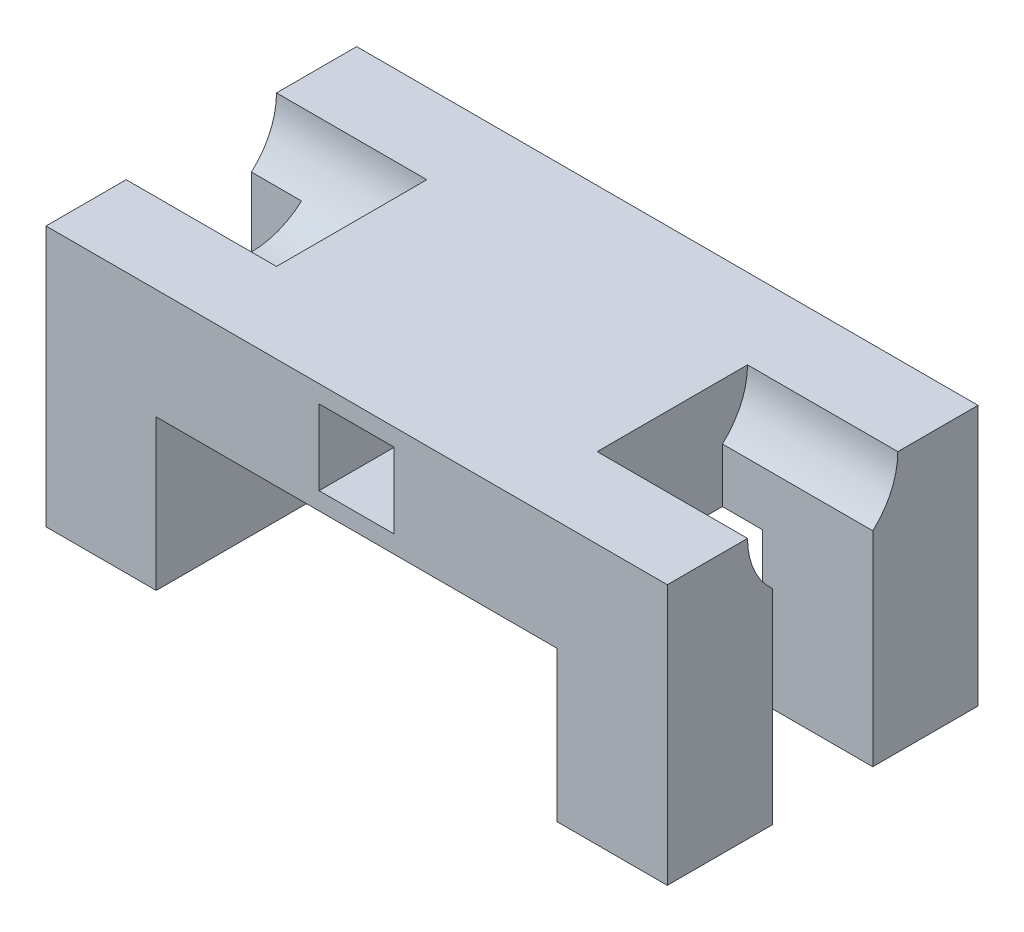
ISO-10303-21;
HEADER;
FILE_DESCRIPTION(('STEP AP214'),'2;1');
FILE_NAME('part.step','',(''),(''),'','','');
FILE_SCHEMA(('AUTOMOTIVE_DESIGN { 1 0 10303 214 1 1 1 1 }'));
ENDSEC;
DATA;
#1=APPLICATION_CONTEXT('core data for automotive mechanical design processes');
#2=APPLICATION_PROTOCOL_DEFINITION('international standard','automotive_design',2000,#1);
#3=PRODUCT_CONTEXT('',#1,'mechanical');
#4=PRODUCT('Part','Part','',(#3));
#5=PRODUCT_RELATED_PRODUCT_CATEGORY('part','',(#4));
#6=PRODUCT_DEFINITION_FORMATION('','',#4);
#7=PRODUCT_DEFINITION_CONTEXT('part definition',#1,'design');
#8=PRODUCT_DEFINITION('design','',#6,#7);
#9=PRODUCT_DEFINITION_SHAPE('','',#8);
#10=(LENGTH_UNIT() NAMED_UNIT(*) SI_UNIT(.MILLI.,.METRE.));
#11=(NAMED_UNIT(*) PLANE_ANGLE_UNIT() SI_UNIT($,.RADIAN.));
#12=(NAMED_UNIT(*) SI_UNIT($,.STERADIAN.) SOLID_ANGLE_UNIT());
#13=UNCERTAINTY_MEASURE_WITH_UNIT(LENGTH_MEASURE(1.E-05),#10,'distance_accuracy_value','');
#14=(GEOMETRIC_REPRESENTATION_CONTEXT(3) GLOBAL_UNCERTAINTY_ASSIGNED_CONTEXT((#13)) GLOBAL_UNIT_ASSIGNED_CONTEXT((#10,
#11,#12)) REPRESENTATION_CONTEXT('',''));
#15=CARTESIAN_POINT('',(0.,0.,0.));
#16=DIRECTION('',(0.,0.,1.));
#17=DIRECTION('',(1.,0.,0.));
#18=AXIS2_PLACEMENT_3D('',#15,#16,#17);
#19=CARTESIAN_POINT('',(102.,0.0297956274635156,62.));
#20=DIRECTION('',(1.,0.,0.));
#21=DIRECTION('',(0.,0.,-1.));
#22=AXIS2_PLACEMENT_3D('',#19,#20,#21);
#23=PLANE('',#22);
#24=DIRECTION('',(0.,0.,-1.));
#25=VECTOR('',#24,1.);
#26=CARTESIAN_POINT('',(102.,0.0297956274635156,62.));
#27=LINE('',#26,#25);
#28=CARTESIAN_POINT('',(102.,0.0297956274635156,21.));
#29=VERTEX_POINT('',#28);
#30=CARTESIAN_POINT('',(102.,0.0297956274635156,0.));
#31=VERTEX_POINT('',#30);
#32=EDGE_CURVE('E457',#29,#31,#27,.T.);
#33=ORIENTED_EDGE('',*,*,#32,.F.);
#34=DIRECTION('',(0.,1.,0.));
#35=VECTOR('',#34,1.);
#36=CARTESIAN_POINT('',(102.,0.0297956274635156,21.));
#37=LINE('',#36,#35);
#38=CARTESIAN_POINT('',(102.,30.,21.));
#39=VERTEX_POINT('',#38);
#40=EDGE_CURVE('E281',#29,#39,#37,.T.);
#41=ORIENTED_EDGE('',*,*,#40,.T.);
#42=DIRECTION('',(0.,0.,-1.));
#43=VECTOR('',#42,1.);
#44=CARTESIAN_POINT('',(102.,30.,62.));
#45=LINE('',#44,#43);
#46=CARTESIAN_POINT('',(102.,30.,0.));
#47=VERTEX_POINT('',#46);
#48=EDGE_CURVE('E462',#39,#47,#45,.T.);
#49=ORIENTED_EDGE('',*,*,#48,.T.);
#50=DIRECTION('',(0.,-1.,0.));
#51=VECTOR('',#50,1.);
#52=CARTESIAN_POINT('',(102.,0.0297956274635156,0.));
#53=LINE('',#52,#51);
#54=EDGE_CURVE('E420',#47,#31,#53,.T.);
#55=ORIENTED_EDGE('',*,*,#54,.T.);
#56=EDGE_LOOP('',(#33,#41,#49,#55));
#57=FACE_BOUND('',#56,.T.);
#58=ADVANCED_FACE('F39',(#57),#23,.F.);
#59=CARTESIAN_POINT('',(124.,0.0297956274635164,62.));
#60=DIRECTION('',(0.,1.,0.));
#61=DIRECTION('',(-1.,0.,0.));
#62=AXIS2_PLACEMENT_3D('',#59,#60,#61);
#63=PLANE('',#62);
#64=DIRECTION('',(0.,0.,-1.));
#65=VECTOR('',#64,1.);
#66=CARTESIAN_POINT('',(124.,0.0297956274635164,62.));
#67=LINE('',#66,#65);
#68=CARTESIAN_POINT('',(124.,0.0297956274635316,21.));
#69=VERTEX_POINT('',#68);
#70=CARTESIAN_POINT('',(124.,0.0297956274635164,0.));
#71=VERTEX_POINT('',#70);
#72=EDGE_CURVE('E452',#69,#71,#67,.T.);
#73=ORIENTED_EDGE('',*,*,#72,.F.);
#74=DIRECTION('',(-1.,0.,0.));
#75=VECTOR('',#74,1.);
#76=CARTESIAN_POINT('',(124.,0.0297956274635164,21.));
#77=LINE('',#76,#75);
#78=EDGE_CURVE('E277',#69,#29,#77,.T.);
#79=ORIENTED_EDGE('',*,*,#78,.T.);
#80=ORIENTED_EDGE('',*,*,#32,.T.);
#81=DIRECTION('',(1.,0.,0.));
#82=VECTOR('',#81,1.);
#83=CARTESIAN_POINT('',(124.,0.0297956274635164,0.));
#84=LINE('',#83,#82);
#85=EDGE_CURVE('E424',#31,#71,#84,.T.);
#86=ORIENTED_EDGE('',*,*,#85,.T.);
#87=EDGE_LOOP('',(#73,#79,#80,#86));
#88=FACE_BOUND('',#87,.T.);
#89=ADVANCED_FACE('F539',(#88),#63,.F.);
#90=CARTESIAN_POINT('',(124.,52.,62.));
#91=DIRECTION('',(-1.,0.,0.));
#92=DIRECTION('',(0.,0.,1.));
#93=AXIS2_PLACEMENT_3D('',#90,#91,#92);
#94=PLANE('',#93);
#95=DIRECTION('',(0.,0.,-1.));
#96=VECTOR('',#95,1.);
#97=CARTESIAN_POINT('',(124.,52.,62.));
#98=LINE('',#97,#96);
#99=CARTESIAN_POINT('',(124.,52.,16.));
#100=VERTEX_POINT('',#99);
#101=CARTESIAN_POINT('',(124.,52.,0.));
#102=VERTEX_POINT('',#101);
#103=EDGE_CURVE('E448',#100,#102,#98,.T.);
#104=ORIENTED_EDGE('',*,*,#103,.F.);
#105=CARTESIAN_POINT('',(124.,52.,31.));
#106=DIRECTION('',(1.,0.,0.));
#107=DIRECTION('',(0.,0.,-1.));
#108=AXIS2_PLACEMENT_3D('',#105,#106,#107);
#109=CIRCLE('',#108,15.);
#110=CARTESIAN_POINT('',(124.,40.819660112501,21.));
#111=VERTEX_POINT('',#110);
#112=EDGE_CURVE('E235',#111,#100,#109,.T.);
#113=ORIENTED_EDGE('',*,*,#112,.F.);
#114=DIRECTION('',(0.,1.,0.));
#115=VECTOR('',#114,1.);
#116=CARTESIAN_POINT('',(124.,52.,21.));
#117=LINE('',#116,#115);
#118=EDGE_CURVE('E250',#69,#111,#117,.T.);
#119=ORIENTED_EDGE('',*,*,#118,.F.);
#120=ORIENTED_EDGE('',*,*,#72,.T.);
#121=DIRECTION('',(0.,1.,0.));
#122=VECTOR('',#121,1.);
#123=CARTESIAN_POINT('',(124.,52.,0.));
#124=LINE('',#123,#122);
#125=EDGE_CURVE('E428',#71,#102,#124,.T.);
#126=ORIENTED_EDGE('',*,*,#125,.T.);
#127=EDGE_LOOP('',(#104,#113,#119,#120,#126));
#128=FACE_BOUND('',#127,.T.);
#129=ADVANCED_FACE('F542',(#128),#94,.F.);
#130=CARTESIAN_POINT('',(0.,0.,62.));
#131=DIRECTION('',(1.,0.,0.));
#132=DIRECTION('',(0.,0.,-1.));
#133=AXIS2_PLACEMENT_3D('',#130,#131,#132);
#134=PLANE('',#133);
#135=DIRECTION('',(0.,-1.,0.));
#136=VECTOR('',#135,1.);
#137=CARTESIAN_POINT('',(0.,0.,21.));
#138=LINE('',#137,#136);
#139=CARTESIAN_POINT('',(0.,40.8196601125011,21.));
#140=VERTEX_POINT('',#139);
#141=CARTESIAN_POINT('',(0.,0.,21.));
#142=VERTEX_POINT('',#141);
#143=EDGE_CURVE('E314',#140,#142,#138,.T.);
#144=ORIENTED_EDGE('',*,*,#143,.F.);
#145=CARTESIAN_POINT('',(0.,52.,31.));
#146=DIRECTION('',(-1.,0.,0.));
#147=DIRECTION('',(0.,0.,1.));
#148=AXIS2_PLACEMENT_3D('',#145,#146,#147);
#149=CIRCLE('',#148,15.);
#150=CARTESIAN_POINT('',(0.,52.,16.));
#151=VERTEX_POINT('',#150);
#152=EDGE_CURVE('E295',#151,#140,#149,.T.);
#153=ORIENTED_EDGE('',*,*,#152,.F.);
#154=DIRECTION('',(0.,0.,-1.));
#155=VECTOR('',#154,1.);
#156=CARTESIAN_POINT('',(0.,52.,62.));
#157=LINE('',#156,#155);
#158=CARTESIAN_POINT('',(0.,52.,0.));
#159=VERTEX_POINT('',#158);
#160=EDGE_CURVE('E443',#151,#159,#157,.T.);
#161=ORIENTED_EDGE('',*,*,#160,.T.);
#162=DIRECTION('',(0.,-1.,0.));
#163=VECTOR('',#162,1.);
#164=CARTESIAN_POINT('',(0.,0.,0.));
#165=LINE('',#164,#163);
#166=CARTESIAN_POINT('',(0.,0.,0.));
#167=VERTEX_POINT('',#166);
#168=EDGE_CURVE('E388',#159,#167,#165,.T.);
#169=ORIENTED_EDGE('',*,*,#168,.T.);
#170=DIRECTION('',(0.,0.,-1.));
#171=VECTOR('',#170,1.);
#172=CARTESIAN_POINT('',(0.,0.,62.));
#173=LINE('',#172,#171);
#174=EDGE_CURVE('E409',#142,#167,#173,.T.);
#175=ORIENTED_EDGE('',*,*,#174,.F.);
#176=EDGE_LOOP('',(#144,#153,#161,#169,#175));
#177=FACE_BOUND('',#176,.T.);
#178=ADVANCED_FACE('F515',(#177),#134,.F.);
#179=CARTESIAN_POINT('',(0.,0.,62.));
#180=DIRECTION('',(0.,0.,-1.));
#181=DIRECTION('',(-1.,0.,0.));
#182=AXIS2_PLACEMENT_3D('',#179,#180,#181);
#183=PLANE('',#182);
#184=DIRECTION('',(1.,0.,0.));
#185=VECTOR('',#184,1.);
#186=CARTESIAN_POINT('',(22.,0.,62.));
#187=LINE('',#186,#185);
#188=CARTESIAN_POINT('',(0.,0.,62.));
#189=VERTEX_POINT('',#188);
#190=CARTESIAN_POINT('',(22.,0.,62.));
#191=VERTEX_POINT('',#190);
#192=EDGE_CURVE('E383',#189,#191,#187,.T.);
#193=ORIENTED_EDGE('',*,*,#192,.T.);
#194=DIRECTION('',(0.,1.,0.));
#195=VECTOR('',#194,1.);
#196=CARTESIAN_POINT('',(22.,30.,62.));
#197=LINE('',#196,#195);
#198=CARTESIAN_POINT('',(22.,30.,62.));
#199=VERTEX_POINT('',#198);
#200=EDGE_CURVE('E387',#191,#199,#197,.T.);
#201=ORIENTED_EDGE('',*,*,#200,.T.);
#202=DIRECTION('',(1.,0.,0.));
#203=VECTOR('',#202,1.);
#204=CARTESIAN_POINT('',(102.,30.,62.));
#205=LINE('',#204,#203);
#206=CARTESIAN_POINT('',(102.,30.,62.));
#207=VERTEX_POINT('',#206);
#208=EDGE_CURVE('E391',#199,#207,#205,.T.);
#209=ORIENTED_EDGE('',*,*,#208,.T.);
#210=DIRECTION('',(0.,-1.,0.));
#211=VECTOR('',#210,1.);
#212=CARTESIAN_POINT('',(102.,0.0297956274635156,62.));
#213=LINE('',#212,#211);
#214=CARTESIAN_POINT('',(102.,0.0297956274635156,62.));
#215=VERTEX_POINT('',#214);
#216=EDGE_CURVE('E394',#207,#215,#213,.T.);
#217=ORIENTED_EDGE('',*,*,#216,.T.);
#218=DIRECTION('',(1.,0.,0.));
#219=VECTOR('',#218,1.);
#220=CARTESIAN_POINT('',(124.,0.0297956274635164,62.));
#221=LINE('',#220,#219);
#222=CARTESIAN_POINT('',(124.,0.0297956274635164,62.));
#223=VERTEX_POINT('',#222);
#224=EDGE_CURVE('E397',#215,#223,#221,.T.);
#225=ORIENTED_EDGE('',*,*,#224,.T.);
#226=DIRECTION('',(0.,1.,0.));
#227=VECTOR('',#226,1.);
#228=CARTESIAN_POINT('',(124.,52.,62.));
#229=LINE('',#228,#227);
#230=CARTESIAN_POINT('',(124.,52.,62.));
#231=VERTEX_POINT('',#230);
#232=EDGE_CURVE('E400',#223,#231,#229,.T.);
#233=ORIENTED_EDGE('',*,*,#232,.T.);
#234=DIRECTION('',(-1.,0.,0.));
#235=VECTOR('',#234,1.);
#236=CARTESIAN_POINT('',(0.,52.,62.));
#237=LINE('',#236,#235);
#238=CARTESIAN_POINT('',(0.,52.,62.));
#239=VERTEX_POINT('',#238);
#240=EDGE_CURVE('E403',#231,#239,#237,.T.);
#241=ORIENTED_EDGE('',*,*,#240,.T.);
#242=DIRECTION('',(0.,-1.,0.));
#243=VECTOR('',#242,1.);
#244=CARTESIAN_POINT('',(0.,0.,62.));
#245=LINE('',#244,#243);
#246=EDGE_CURVE('E406',#239,#189,#245,.T.);
#247=ORIENTED_EDGE('',*,*,#246,.T.);
#248=EDGE_LOOP('',(#193,#201,#209,#217,#225,#233,#241,#247));
#249=FACE_BOUND('',#248,.T.);
#250=DIRECTION('',(0.,1.,0.));
#251=VECTOR('',#250,1.);
#252=CARTESIAN_POINT('',(69.5,48.5,62.));
#253=LINE('',#252,#251);
#254=CARTESIAN_POINT('',(69.5,33.5,62.));
#255=VERTEX_POINT('',#254);
#256=CARTESIAN_POINT('',(69.5,48.5,62.));
#257=VERTEX_POINT('',#256);
#258=EDGE_CURVE('E340',#255,#257,#253,.T.);
#259=ORIENTED_EDGE('',*,*,#258,.F.);
#260=DIRECTION('',(1.,0.,0.));
#261=VECTOR('',#260,1.);
#262=CARTESIAN_POINT('',(69.5,33.5,62.));
#263=LINE('',#262,#261);
#264=CARTESIAN_POINT('',(54.5,33.5,62.));
#265=VERTEX_POINT('',#264);
#266=EDGE_CURVE('E351',#265,#255,#263,.T.);
#267=ORIENTED_EDGE('',*,*,#266,.F.);
#268=DIRECTION('',(0.,-1.,0.));
#269=VECTOR('',#268,1.);
#270=CARTESIAN_POINT('',(54.5,48.5,62.));
#271=LINE('',#270,#269);
#272=CARTESIAN_POINT('',(54.5,48.5,62.));
#273=VERTEX_POINT('',#272);
#274=EDGE_CURVE('E347',#273,#265,#271,.T.);
#275=ORIENTED_EDGE('',*,*,#274,.F.);
#276=DIRECTION('',(-1.,0.,0.));
#277=VECTOR('',#276,1.);
#278=CARTESIAN_POINT('',(69.5,48.5,62.));
#279=LINE('',#278,#277);
#280=EDGE_CURVE('E343',#257,#273,#279,.T.);
#281=ORIENTED_EDGE('',*,*,#280,.F.);
#282=EDGE_LOOP('',(#259,#267,#275,#281));
#283=FACE_BOUND('',#282,.T.);
#284=ADVANCED_FACE('F496',(#249,#283),#183,.F.);
#285=CARTESIAN_POINT('',(0.,0.,0.));
#286=DIRECTION('',(0.,0.,-1.));
#287=DIRECTION('',(-1.,0.,0.));
#288=AXIS2_PLACEMENT_3D('',#285,#286,#287);
#289=PLANE('',#288);
#290=DIRECTION('',(1.,0.,0.));
#291=VECTOR('',#290,1.);
#292=CARTESIAN_POINT('',(22.,0.,0.));
#293=LINE('',#292,#291);
#294=CARTESIAN_POINT('',(22.,0.,0.));
#295=VERTEX_POINT('',#294);
#296=EDGE_CURVE('E382',#167,#295,#293,.T.);
#297=ORIENTED_EDGE('',*,*,#296,.F.);
#298=ORIENTED_EDGE('',*,*,#168,.F.);
#299=DIRECTION('',(-1.,0.,0.));
#300=VECTOR('',#299,1.);
#301=CARTESIAN_POINT('',(0.,52.,0.));
#302=LINE('',#301,#300);
#303=EDGE_CURVE('E432',#102,#159,#302,.T.);
#304=ORIENTED_EDGE('',*,*,#303,.F.);
#305=ORIENTED_EDGE('',*,*,#125,.F.);
#306=ORIENTED_EDGE('',*,*,#85,.F.);
#307=ORIENTED_EDGE('',*,*,#54,.F.);
#308=DIRECTION('',(1.,0.,0.));
#309=VECTOR('',#308,1.);
#310=CARTESIAN_POINT('',(102.,30.,0.));
#311=LINE('',#310,#309);
#312=CARTESIAN_POINT('',(22.,30.,0.));
#313=VERTEX_POINT('',#312);
#314=EDGE_CURVE('E416',#313,#47,#311,.T.);
#315=ORIENTED_EDGE('',*,*,#314,.F.);
#316=DIRECTION('',(0.,1.,0.));
#317=VECTOR('',#316,1.);
#318=CARTESIAN_POINT('',(22.,30.,0.));
#319=LINE('',#318,#317);
#320=EDGE_CURVE('E413',#295,#313,#319,.T.);
#321=ORIENTED_EDGE('',*,*,#320,.F.);
#322=EDGE_LOOP('',(#297,#298,#304,#305,#306,#307,#315,#321));
#323=FACE_BOUND('',#322,.T.);
#324=DIRECTION('',(1.,0.,0.));
#325=VECTOR('',#324,1.);
#326=CARTESIAN_POINT('',(69.5,33.5,0.));
#327=LINE('',#326,#325);
#328=CARTESIAN_POINT('',(54.5,33.5,0.));
#329=VERTEX_POINT('',#328);
#330=CARTESIAN_POINT('',(69.5,33.5,0.));
#331=VERTEX_POINT('',#330);
#332=EDGE_CURVE('E344',#329,#331,#327,.T.);
#333=ORIENTED_EDGE('',*,*,#332,.T.);
#334=DIRECTION('',(0.,1.,0.));
#335=VECTOR('',#334,1.);
#336=CARTESIAN_POINT('',(69.5,48.5,0.));
#337=LINE('',#336,#335);
#338=CARTESIAN_POINT('',(69.5,48.5,0.));
#339=VERTEX_POINT('',#338);
#340=EDGE_CURVE('E336',#331,#339,#337,.T.);
#341=ORIENTED_EDGE('',*,*,#340,.T.);
#342=DIRECTION('',(-1.,0.,0.));
#343=VECTOR('',#342,1.);
#344=CARTESIAN_POINT('',(69.5,48.5,0.));
#345=LINE('',#344,#343);
#346=CARTESIAN_POINT('',(54.5,48.5,0.));
#347=VERTEX_POINT('',#346);
#348=EDGE_CURVE('E358',#339,#347,#345,.T.);
#349=ORIENTED_EDGE('',*,*,#348,.T.);
#350=DIRECTION('',(0.,-1.,0.));
#351=VECTOR('',#350,1.);
#352=CARTESIAN_POINT('',(54.5,48.5,0.));
#353=LINE('',#352,#351);
#354=EDGE_CURVE('E362',#347,#329,#353,.T.);
#355=ORIENTED_EDGE('',*,*,#354,.T.);
#356=EDGE_LOOP('',(#333,#341,#349,#355));
#357=FACE_BOUND('',#356,.T.);
#358=ADVANCED_FACE('F483',(#323,#357),#289,.T.);
#359=CARTESIAN_POINT('',(22.,0.,62.));
#360=DIRECTION('',(0.,1.,0.));
#361=DIRECTION('',(0.,0.,1.));
#362=AXIS2_PLACEMENT_3D('',#359,#360,#361);
#363=PLANE('',#362);
#364=DIRECTION('',(0.,0.,1.));
#365=VECTOR('',#364,1.);
#366=CARTESIAN_POINT('',(9.99999999999999,0.,21.));
#367=LINE('',#366,#365);
#368=CARTESIAN_POINT('',(9.99999999999999,0.,21.));
#369=VERTEX_POINT('',#368);
#370=CARTESIAN_POINT('',(9.99999999999999,0.,41.));
#371=VERTEX_POINT('',#370);
#372=EDGE_CURVE('E318',#369,#371,#367,.T.);
#373=ORIENTED_EDGE('',*,*,#372,.F.);
#374=DIRECTION('',(-1.,0.,0.));
#375=VECTOR('',#374,1.);
#376=CARTESIAN_POINT('',(9.99999999999999,0.,21.));
#377=LINE('',#376,#375);
#378=EDGE_CURVE('E327',#369,#142,#377,.T.);
#379=ORIENTED_EDGE('',*,*,#378,.T.);
#380=ORIENTED_EDGE('',*,*,#174,.T.);
#381=ORIENTED_EDGE('',*,*,#296,.T.);
#382=DIRECTION('',(0.,0.,-1.));
#383=VECTOR('',#382,1.);
#384=CARTESIAN_POINT('',(22.,0.,62.));
#385=LINE('',#384,#383);
#386=EDGE_CURVE('E48',#191,#295,#385,.T.);
#387=ORIENTED_EDGE('',*,*,#386,.F.);
#388=ORIENTED_EDGE('',*,*,#192,.F.);
#389=CARTESIAN_POINT('',(0.,0.,41.));
#390=VERTEX_POINT('',#389);
#391=EDGE_CURVE('E439',#189,#390,#173,.T.);
#392=ORIENTED_EDGE('',*,*,#391,.T.);
#393=DIRECTION('',(-1.,0.,0.));
#394=VECTOR('',#393,1.);
#395=CARTESIAN_POINT('',(9.99999999999999,0.,41.));
#396=LINE('',#395,#394);
#397=EDGE_CURVE('E333',#371,#390,#396,.T.);
#398=ORIENTED_EDGE('',*,*,#397,.F.);
#399=EDGE_LOOP('',(#373,#379,#380,#381,#387,#388,#392,#398));
#400=FACE_BOUND('',#399,.T.);
#401=ADVANCED_FACE('F41',(#400),#363,.F.);
#402=CARTESIAN_POINT('',(22.,30.,62.));
#403=DIRECTION('',(-1.,0.,0.));
#404=DIRECTION('',(0.,-1.,0.));
#405=AXIS2_PLACEMENT_3D('',#402,#403,#404);
#406=PLANE('',#405);
#407=ORIENTED_EDGE('',*,*,#320,.T.);
#408=DIRECTION('',(0.,0.,-1.));
#409=VECTOR('',#408,1.);
#410=CARTESIAN_POINT('',(22.,30.,62.));
#411=LINE('',#410,#409);
#412=EDGE_CURVE('E467',#199,#313,#411,.T.);
#413=ORIENTED_EDGE('',*,*,#412,.F.);
#414=ORIENTED_EDGE('',*,*,#200,.F.);
#415=ORIENTED_EDGE('',*,*,#386,.T.);
#416=EDGE_LOOP('',(#407,#413,#414,#415));
#417=FACE_BOUND('',#416,.T.);
#418=ADVANCED_FACE('F474',(#417),#406,.F.);
#419=CARTESIAN_POINT('',(102.,30.,62.));
#420=DIRECTION('',(0.,1.,0.));
#421=DIRECTION('',(-1.,0.,0.));
#422=AXIS2_PLACEMENT_3D('',#419,#420,#421);
#423=PLANE('',#422);
#424=ORIENTED_EDGE('',*,*,#48,.F.);
#425=DIRECTION('',(-1.,0.,0.));
#426=VECTOR('',#425,1.);
#427=CARTESIAN_POINT('',(102.,30.,21.));
#428=LINE('',#427,#426);
#429=CARTESIAN_POINT('',(94.,30.,21.));
#430=VERTEX_POINT('',#429);
#431=EDGE_CURVE('E285',#39,#430,#428,.T.);
#432=ORIENTED_EDGE('',*,*,#431,.T.);
#433=DIRECTION('',(0.,0.,1.));
#434=VECTOR('',#433,1.);
#435=CARTESIAN_POINT('',(94.,30.,62.));
#436=LINE('',#435,#434);
#437=CARTESIAN_POINT('',(94.,30.,41.));
#438=VERTEX_POINT('',#437);
#439=EDGE_CURVE('E256',#430,#438,#436,.T.);
#440=ORIENTED_EDGE('',*,*,#439,.T.);
#441=DIRECTION('',(1.,0.,0.));
#442=VECTOR('',#441,1.);
#443=CARTESIAN_POINT('',(102.,30.,41.));
#444=LINE('',#443,#442);
#445=CARTESIAN_POINT('',(102.,30.,41.));
#446=VERTEX_POINT('',#445);
#447=EDGE_CURVE('E273',#438,#446,#444,.T.);
#448=ORIENTED_EDGE('',*,*,#447,.T.);
#449=EDGE_CURVE('E463',#207,#446,#45,.T.);
#450=ORIENTED_EDGE('',*,*,#449,.F.);
#451=ORIENTED_EDGE('',*,*,#208,.F.);
#452=ORIENTED_EDGE('',*,*,#412,.T.);
#453=ORIENTED_EDGE('',*,*,#314,.T.);
#454=EDGE_LOOP('',(#424,#432,#440,#448,#450,#451,#452,#453));
#455=FACE_BOUND('',#454,.T.);
#456=ADVANCED_FACE('F491',(#455),#423,.F.);
#457=ORIENTED_EDGE('',*,*,#449,.T.);
#458=DIRECTION('',(0.,-1.,0.));
#459=VECTOR('',#458,1.);
#460=CARTESIAN_POINT('',(102.,0.0297956274635156,41.));
#461=LINE('',#460,#459);
#462=CARTESIAN_POINT('',(102.,0.0297956274635156,41.));
#463=VERTEX_POINT('',#462);
#464=EDGE_CURVE('E269',#446,#463,#461,.T.);
#465=ORIENTED_EDGE('',*,*,#464,.T.);
#466=EDGE_CURVE('E458',#215,#463,#27,.T.);
#467=ORIENTED_EDGE('',*,*,#466,.F.);
#468=ORIENTED_EDGE('',*,*,#216,.F.);
#469=EDGE_LOOP('',(#457,#465,#467,#468));
#470=FACE_BOUND('',#469,.T.);
#471=ADVANCED_FACE('F548',(#470),#23,.F.);
#472=ORIENTED_EDGE('',*,*,#466,.T.);
#473=DIRECTION('',(1.,0.,0.));
#474=VECTOR('',#473,1.);
#475=CARTESIAN_POINT('',(124.,0.0297956274635164,41.));
#476=LINE('',#475,#474);
#477=CARTESIAN_POINT('',(124.,0.0297956274635316,41.));
#478=VERTEX_POINT('',#477);
#479=EDGE_CURVE('E265',#463,#478,#476,.T.);
#480=ORIENTED_EDGE('',*,*,#479,.T.);
#481=EDGE_CURVE('E453',#223,#478,#67,.T.);
#482=ORIENTED_EDGE('',*,*,#481,.F.);
#483=ORIENTED_EDGE('',*,*,#224,.F.);
#484=EDGE_LOOP('',(#472,#480,#482,#483));
#485=FACE_BOUND('',#484,.T.);
#486=ADVANCED_FACE('F551',(#485),#63,.F.);
#487=DIRECTION('',(0.,-1.,0.));
#488=VECTOR('',#487,1.);
#489=CARTESIAN_POINT('',(124.,52.,41.));
#490=LINE('',#489,#488);
#491=CARTESIAN_POINT('',(124.,40.819660112501,41.));
#492=VERTEX_POINT('',#491);
#493=EDGE_CURVE('E252',#492,#478,#490,.T.);
#494=ORIENTED_EDGE('',*,*,#493,.F.);
#495=CARTESIAN_POINT('',(124.,52.,46.));
#496=VERTEX_POINT('',#495);
#497=EDGE_CURVE('E231',#496,#492,#109,.T.);
#498=ORIENTED_EDGE('',*,*,#497,.F.);
#499=EDGE_CURVE('E449',#231,#496,#98,.T.);
#500=ORIENTED_EDGE('',*,*,#499,.F.);
#501=ORIENTED_EDGE('',*,*,#232,.F.);
#502=ORIENTED_EDGE('',*,*,#481,.T.);
#503=EDGE_LOOP('',(#494,#498,#500,#501,#502));
#504=FACE_BOUND('',#503,.T.);
#505=ADVANCED_FACE('F558',(#504),#94,.F.);
#506=CARTESIAN_POINT('',(0.,52.,62.));
#507=DIRECTION('',(0.,-1.,0.));
#508=DIRECTION('',(0.,0.,-1.));
#509=AXIS2_PLACEMENT_3D('',#506,#507,#508);
#510=PLANE('',#509);
#511=DIRECTION('',(0.,0.,1.));
#512=VECTOR('',#511,1.);
#513=CARTESIAN_POINT('',(94.,52.,21.));
#514=LINE('',#513,#512);
#515=CARTESIAN_POINT('',(94.,52.,16.));
#516=VERTEX_POINT('',#515);
#517=CARTESIAN_POINT('',(94.,52.,46.));
#518=VERTEX_POINT('',#517);
#519=EDGE_CURVE('E212',#516,#518,#514,.T.);
#520=ORIENTED_EDGE('',*,*,#519,.F.);
#521=DIRECTION('',(1.,0.,0.));
#522=VECTOR('',#521,1.);
#523=CARTESIAN_POINT('',(94.,52.,16.));
#524=LINE('',#523,#522);
#525=EDGE_CURVE('E216',#516,#100,#524,.T.);
#526=ORIENTED_EDGE('',*,*,#525,.T.);
#527=ORIENTED_EDGE('',*,*,#103,.T.);
#528=ORIENTED_EDGE('',*,*,#303,.T.);
#529=ORIENTED_EDGE('',*,*,#160,.F.);
#530=DIRECTION('',(-1.,0.,0.));
#531=VECTOR('',#530,1.);
#532=CARTESIAN_POINT('',(30.,52.,16.));
#533=LINE('',#532,#531);
#534=CARTESIAN_POINT('',(30.,52.,16.));
#535=VERTEX_POINT('',#534);
#536=EDGE_CURVE('E302',#535,#151,#533,.T.);
#537=ORIENTED_EDGE('',*,*,#536,.F.);
#538=DIRECTION('',(0.,0.,-1.));
#539=VECTOR('',#538,1.);
#540=CARTESIAN_POINT('',(30.,52.,16.));
#541=LINE('',#540,#539);
#542=CARTESIAN_POINT('',(30.,52.,46.));
#543=VERTEX_POINT('',#542);
#544=EDGE_CURVE('E294',#543,#535,#541,.T.);
#545=ORIENTED_EDGE('',*,*,#544,.F.);
#546=DIRECTION('',(-1.,0.,0.));
#547=VECTOR('',#546,1.);
#548=CARTESIAN_POINT('',(30.,52.,46.));
#549=LINE('',#548,#547);
#550=CARTESIAN_POINT('',(0.,52.,46.));
#551=VERTEX_POINT('',#550);
#552=EDGE_CURVE('E299',#543,#551,#549,.T.);
#553=ORIENTED_EDGE('',*,*,#552,.T.);
#554=EDGE_CURVE('E444',#239,#551,#157,.T.);
#555=ORIENTED_EDGE('',*,*,#554,.F.);
#556=ORIENTED_EDGE('',*,*,#240,.F.);
#557=ORIENTED_EDGE('',*,*,#499,.T.);
#558=DIRECTION('',(1.,0.,0.));
#559=VECTOR('',#558,1.);
#560=CARTESIAN_POINT('',(94.,52.,46.));
#561=LINE('',#560,#559);
#562=EDGE_CURVE('E219',#518,#496,#561,.T.);
#563=ORIENTED_EDGE('',*,*,#562,.F.);
#564=EDGE_LOOP('',(#520,#526,#527,#528,#529,#537,#545,#553,#555,#556,#557,#563));
#565=FACE_BOUND('',#564,.T.);
#566=ADVANCED_FACE('F214',(#565),#510,.F.);
#567=ORIENTED_EDGE('',*,*,#554,.T.);
#568=CARTESIAN_POINT('',(0.,40.8196601125011,41.));
#569=VERTEX_POINT('',#568);
#570=EDGE_CURVE('E289',#569,#551,#149,.T.);
#571=ORIENTED_EDGE('',*,*,#570,.F.);
#572=DIRECTION('',(0.,1.,0.));
#573=VECTOR('',#572,1.);
#574=CARTESIAN_POINT('',(0.,0.,41.));
#575=LINE('',#574,#573);
#576=EDGE_CURVE('E319',#390,#569,#575,.T.);
#577=ORIENTED_EDGE('',*,*,#576,.F.);
#578=ORIENTED_EDGE('',*,*,#391,.F.);
#579=ORIENTED_EDGE('',*,*,#246,.F.);
#580=EDGE_LOOP('',(#567,#571,#577,#578,#579));
#581=FACE_BOUND('',#580,.T.);
#582=ADVANCED_FACE('F504',(#581),#134,.F.);
#583=CARTESIAN_POINT('',(69.5,48.5,62.));
#584=DIRECTION('',(-1.,0.,0.));
#585=DIRECTION('',(0.,0.,1.));
#586=AXIS2_PLACEMENT_3D('',#583,#584,#585);
#587=PLANE('',#586);
#588=ORIENTED_EDGE('',*,*,#340,.F.);
#589=DIRECTION('',(0.,0.,-1.));
#590=VECTOR('',#589,1.);
#591=CARTESIAN_POINT('',(69.5,33.5,62.));
#592=LINE('',#591,#590);
#593=EDGE_CURVE('E354',#255,#331,#592,.T.);
#594=ORIENTED_EDGE('',*,*,#593,.F.);
#595=ORIENTED_EDGE('',*,*,#258,.T.);
#596=DIRECTION('',(0.,0.,-1.));
#597=VECTOR('',#596,1.);
#598=CARTESIAN_POINT('',(69.5,48.5,62.));
#599=LINE('',#598,#597);
#600=EDGE_CURVE('E378',#257,#339,#599,.T.);
#601=ORIENTED_EDGE('',*,*,#600,.T.);
#602=EDGE_LOOP('',(#588,#594,#595,#601));
#603=FACE_BOUND('',#602,.T.);
#604=ADVANCED_FACE('F600',(#603),#587,.T.);
#605=CARTESIAN_POINT('',(69.5,48.5,62.));
#606=DIRECTION('',(0.,-1.,0.));
#607=DIRECTION('',(0.,0.,-1.));
#608=AXIS2_PLACEMENT_3D('',#605,#606,#607);
#609=PLANE('',#608);
#610=ORIENTED_EDGE('',*,*,#348,.F.);
#611=ORIENTED_EDGE('',*,*,#600,.F.);
#612=ORIENTED_EDGE('',*,*,#280,.T.);
#613=DIRECTION('',(0.,0.,-1.));
#614=VECTOR('',#613,1.);
#615=CARTESIAN_POINT('',(54.5,48.5,62.));
#616=LINE('',#615,#614);
#617=EDGE_CURVE('E375',#273,#347,#616,.T.);
#618=ORIENTED_EDGE('',*,*,#617,.T.);
#619=EDGE_LOOP('',(#610,#611,#612,#618));
#620=FACE_BOUND('',#619,.T.);
#621=ADVANCED_FACE('F636',(#620),#609,.T.);
#622=CARTESIAN_POINT('',(54.5,48.5,62.));
#623=DIRECTION('',(1.,0.,0.));
#624=DIRECTION('',(0.,0.,-1.));
#625=AXIS2_PLACEMENT_3D('',#622,#623,#624);
#626=PLANE('',#625);
#627=ORIENTED_EDGE('',*,*,#354,.F.);
#628=ORIENTED_EDGE('',*,*,#617,.F.);
#629=ORIENTED_EDGE('',*,*,#274,.T.);
#630=DIRECTION('',(0.,0.,-1.));
#631=VECTOR('',#630,1.);
#632=CARTESIAN_POINT('',(54.5,33.5,62.));
#633=LINE('',#632,#631);
#634=EDGE_CURVE('E372',#265,#329,#633,.T.);
#635=ORIENTED_EDGE('',*,*,#634,.T.);
#636=EDGE_LOOP('',(#627,#628,#629,#635));
#637=FACE_BOUND('',#636,.T.);
#638=ADVANCED_FACE('F646',(#637),#626,.T.);
#639=CARTESIAN_POINT('',(69.5,33.5,62.));
#640=DIRECTION('',(0.,1.,0.));
#641=DIRECTION('',(0.,0.,1.));
#642=AXIS2_PLACEMENT_3D('',#639,#640,#641);
#643=PLANE('',#642);
#644=ORIENTED_EDGE('',*,*,#332,.F.);
#645=ORIENTED_EDGE('',*,*,#634,.F.);
#646=ORIENTED_EDGE('',*,*,#266,.T.);
#647=ORIENTED_EDGE('',*,*,#593,.T.);
#648=EDGE_LOOP('',(#644,#645,#646,#647));
#649=FACE_BOUND('',#648,.T.);
#650=ADVANCED_FACE('F656',(#649),#643,.T.);
#651=CARTESIAN_POINT('',(9.99999999999999,0.,21.));
#652=DIRECTION('',(0.,0.,-1.));
#653=DIRECTION('',(-1.,0.,0.));
#654=AXIS2_PLACEMENT_3D('',#651,#652,#653);
#655=PLANE('',#654);
#656=DIRECTION('',(0.,-1.,0.));
#657=VECTOR('',#656,1.);
#658=CARTESIAN_POINT('',(9.99999999999999,0.,21.));
#659=LINE('',#658,#657);
#660=CARTESIAN_POINT('',(9.99999999999999,40.8196601125011,21.));
#661=VERTEX_POINT('',#660);
#662=EDGE_CURVE('E315',#661,#369,#659,.T.);
#663=ORIENTED_EDGE('',*,*,#662,.F.);
#664=DIRECTION('',(-1.,0.,0.));
#665=VECTOR('',#664,1.);
#666=CARTESIAN_POINT('',(30.,40.8196601125011,21.));
#667=LINE('',#666,#665);
#668=EDGE_CURVE('E63',#661,#140,#667,.T.);
#669=ORIENTED_EDGE('',*,*,#668,.T.);
#670=ORIENTED_EDGE('',*,*,#143,.T.);
#671=ORIENTED_EDGE('',*,*,#378,.F.);
#672=EDGE_LOOP('',(#663,#669,#670,#671));
#673=FACE_BOUND('',#672,.T.);
#674=ADVANCED_FACE('F665',(#673),#655,.F.);
#675=CARTESIAN_POINT('',(9.99999999999999,0.,41.));
#676=DIRECTION('',(0.,0.,1.));
#677=DIRECTION('',(1.,0.,0.));
#678=AXIS2_PLACEMENT_3D('',#675,#676,#677);
#679=PLANE('',#678);
#680=ORIENTED_EDGE('',*,*,#576,.T.);
#681=DIRECTION('',(-1.,0.,0.));
#682=VECTOR('',#681,1.);
#683=CARTESIAN_POINT('',(30.,40.8196601125011,41.));
#684=LINE('',#683,#682);
#685=CARTESIAN_POINT('',(9.99999999999999,40.8196601125011,41.));
#686=VERTEX_POINT('',#685);
#687=EDGE_CURVE('E305',#569,#686,#684,.F.);
#688=ORIENTED_EDGE('',*,*,#687,.T.);
#689=DIRECTION('',(0.,1.,0.));
#690=VECTOR('',#689,1.);
#691=CARTESIAN_POINT('',(9.99999999999999,0.,41.));
#692=LINE('',#691,#690);
#693=EDGE_CURVE('E323',#371,#686,#692,.T.);
#694=ORIENTED_EDGE('',*,*,#693,.F.);
#695=ORIENTED_EDGE('',*,*,#397,.T.);
#696=EDGE_LOOP('',(#680,#688,#694,#695));
#697=FACE_BOUND('',#696,.T.);
#698=ADVANCED_FACE('F507',(#697),#679,.F.);
#699=CARTESIAN_POINT('',(9.99999999999999,0.,0.));
#700=DIRECTION('',(1.,0.,0.));
#701=DIRECTION('',(0.,0.,-1.));
#702=AXIS2_PLACEMENT_3D('',#699,#700,#701);
#703=PLANE('',#702);
#704=ORIENTED_EDGE('',*,*,#693,.T.);
#705=CARTESIAN_POINT('',(9.99999999999999,52.,31.));
#706=DIRECTION('',(1.,0.,0.));
#707=DIRECTION('',(0.,0.,-1.));
#708=AXIS2_PLACEMENT_3D('',#705,#706,#707);
#709=CIRCLE('',#708,15.);
#710=EDGE_CURVE('E11',#686,#661,#709,.T.);
#711=ORIENTED_EDGE('',*,*,#710,.T.);
#712=ORIENTED_EDGE('',*,*,#662,.T.);
#713=ORIENTED_EDGE('',*,*,#372,.T.);
#714=EDGE_LOOP('',(#704,#711,#712,#713));
#715=FACE_BOUND('',#714,.T.);
#716=ADVANCED_FACE('F509',(#715),#703,.F.);
#717=CARTESIAN_POINT('',(30.,52.,31.));
#718=DIRECTION('',(-1.,0.,0.));
#719=DIRECTION('',(0.,0.,1.));
#720=AXIS2_PLACEMENT_3D('',#717,#718,#719);
#721=CYLINDRICAL_SURFACE('',#720,15.);
#722=ORIENTED_EDGE('',*,*,#710,.F.);
#723=ORIENTED_EDGE('',*,*,#687,.F.);
#724=ORIENTED_EDGE('',*,*,#570,.T.);
#725=ORIENTED_EDGE('',*,*,#552,.F.);
#726=CARTESIAN_POINT('',(30.,52.,31.));
#727=DIRECTION('',(-1.,0.,0.));
#728=DIRECTION('',(0.,0.,1.));
#729=AXIS2_PLACEMENT_3D('',#726,#727,#728);
#730=CIRCLE('',#729,15.);
#731=EDGE_CURVE('E290',#535,#543,#730,.T.);
#732=ORIENTED_EDGE('',*,*,#731,.F.);
#733=ORIENTED_EDGE('',*,*,#536,.T.);
#734=ORIENTED_EDGE('',*,*,#152,.T.);
#735=ORIENTED_EDGE('',*,*,#668,.F.);
#736=EDGE_LOOP('',(#722,#723,#724,#725,#732,#733,#734,#735));
#737=FACE_BOUND('',#736,.T.);
#738=ADVANCED_FACE('F520',(#737),#721,.F.);
#739=CARTESIAN_POINT('',(30.,52.,31.));
#740=DIRECTION('',(-1.,0.,0.));
#741=DIRECTION('',(0.,0.,1.));
#742=AXIS2_PLACEMENT_3D('',#739,#740,#741);
#743=PLANE('',#742);
#744=ORIENTED_EDGE('',*,*,#731,.T.);
#745=ORIENTED_EDGE('',*,*,#544,.T.);
#746=EDGE_LOOP('',(#744,#745));
#747=FACE_BOUND('',#746,.T.);
#748=ADVANCED_FACE('F527',(#747),#743,.T.);
#749=CARTESIAN_POINT('',(94.,52.,21.));
#750=DIRECTION('',(0.,0.,-1.));
#751=DIRECTION('',(-1.,0.,0.));
#752=AXIS2_PLACEMENT_3D('',#749,#750,#751);
#753=PLANE('',#752);
#754=ORIENTED_EDGE('',*,*,#118,.T.);
#755=DIRECTION('',(1.,0.,0.));
#756=VECTOR('',#755,1.);
#757=CARTESIAN_POINT('',(94.,40.819660112501,21.));
#758=LINE('',#757,#756);
#759=CARTESIAN_POINT('',(94.,40.819660112501,21.));
#760=VERTEX_POINT('',#759);
#761=EDGE_CURVE('E247',#111,#760,#758,.F.);
#762=ORIENTED_EDGE('',*,*,#761,.T.);
#763=DIRECTION('',(0.,1.,0.));
#764=VECTOR('',#763,1.);
#765=CARTESIAN_POINT('',(94.,52.,21.));
#766=LINE('',#765,#764);
#767=EDGE_CURVE('E222',#430,#760,#766,.T.);
#768=ORIENTED_EDGE('',*,*,#767,.F.);
#769=ORIENTED_EDGE('',*,*,#431,.F.);
#770=ORIENTED_EDGE('',*,*,#40,.F.);
#771=ORIENTED_EDGE('',*,*,#78,.F.);
#772=EDGE_LOOP('',(#754,#762,#768,#769,#770,#771));
#773=FACE_BOUND('',#772,.T.);
#774=ADVANCED_FACE('F535',(#773),#753,.F.);
#775=CARTESIAN_POINT('',(94.,52.,41.));
#776=DIRECTION('',(0.,0.,1.));
#777=DIRECTION('',(1.,0.,0.));
#778=AXIS2_PLACEMENT_3D('',#775,#776,#777);
#779=PLANE('',#778);
#780=DIRECTION('',(0.,-1.,0.));
#781=VECTOR('',#780,1.);
#782=CARTESIAN_POINT('',(94.,52.,41.));
#783=LINE('',#782,#781);
#784=CARTESIAN_POINT('',(94.,40.819660112501,41.));
#785=VERTEX_POINT('',#784);
#786=EDGE_CURVE('E221',#785,#438,#783,.T.);
#787=ORIENTED_EDGE('',*,*,#786,.F.);
#788=DIRECTION('',(1.,0.,0.));
#789=VECTOR('',#788,1.);
#790=CARTESIAN_POINT('',(94.,40.819660112501,41.));
#791=LINE('',#790,#789);
#792=EDGE_CURVE('E240',#785,#492,#791,.T.);
#793=ORIENTED_EDGE('',*,*,#792,.T.);
#794=ORIENTED_EDGE('',*,*,#493,.T.);
#795=ORIENTED_EDGE('',*,*,#479,.F.);
#796=ORIENTED_EDGE('',*,*,#464,.F.);
#797=ORIENTED_EDGE('',*,*,#447,.F.);
#798=EDGE_LOOP('',(#787,#793,#794,#795,#796,#797));
#799=FACE_BOUND('',#798,.T.);
#800=ADVANCED_FACE('F546',(#799),#779,.F.);
#801=CARTESIAN_POINT('',(94.,0.,0.));
#802=DIRECTION('',(-1.,0.,0.));
#803=DIRECTION('',(0.,0.,1.));
#804=AXIS2_PLACEMENT_3D('',#801,#802,#803);
#805=PLANE('',#804);
#806=ORIENTED_EDGE('',*,*,#767,.T.);
#807=CARTESIAN_POINT('',(94.,52.,31.));
#808=DIRECTION('',(1.,0.,0.));
#809=DIRECTION('',(0.,0.,-1.));
#810=AXIS2_PLACEMENT_3D('',#807,#808,#809);
#811=CIRCLE('',#810,15.);
#812=EDGE_CURVE('E225',#760,#516,#811,.T.);
#813=ORIENTED_EDGE('',*,*,#812,.T.);
#814=ORIENTED_EDGE('',*,*,#519,.T.);
#815=EDGE_CURVE('E55',#518,#785,#811,.T.);
#816=ORIENTED_EDGE('',*,*,#815,.T.);
#817=ORIENTED_EDGE('',*,*,#786,.T.);
#818=ORIENTED_EDGE('',*,*,#439,.F.);
#819=EDGE_LOOP('',(#806,#813,#814,#816,#817,#818));
#820=FACE_BOUND('',#819,.T.);
#821=ADVANCED_FACE('F226',(#820),#805,.F.);
#822=CARTESIAN_POINT('',(94.,52.,31.));
#823=DIRECTION('',(1.,0.,0.));
#824=DIRECTION('',(0.,0.,-1.));
#825=AXIS2_PLACEMENT_3D('',#822,#823,#824);
#826=CYLINDRICAL_SURFACE('',#825,15.);
#827=ORIENTED_EDGE('',*,*,#815,.F.);
#828=ORIENTED_EDGE('',*,*,#562,.T.);
#829=ORIENTED_EDGE('',*,*,#497,.T.);
#830=ORIENTED_EDGE('',*,*,#792,.F.);
#831=EDGE_LOOP('',(#827,#828,#829,#830));
#832=FACE_BOUND('',#831,.T.);
#833=ADVANCED_FACE('F562',(#832),#826,.F.);
#834=ORIENTED_EDGE('',*,*,#112,.T.);
#835=ORIENTED_EDGE('',*,*,#525,.F.);
#836=ORIENTED_EDGE('',*,*,#812,.F.);
#837=ORIENTED_EDGE('',*,*,#761,.F.);
#838=EDGE_LOOP('',(#834,#835,#836,#837));
#839=FACE_BOUND('',#838,.T.);
#840=ADVANCED_FACE('F233',(#839),#826,.F.);
#841=CLOSED_SHELL('',(#58,#89,#129,#178,#284,#358,#401,#418,#456,#471,#486,#505,#566,#582,#604,
#621,#638,#650,#674,#698,#716,#738,#748,#774,#800,#821,#833,#840));
#842=MANIFOLD_SOLID_BREP('B2',#841);
#843=ADVANCED_BREP_SHAPE_REPRESENTATION('',(#18,#842),#14);
#844=SHAPE_DEFINITION_REPRESENTATION(#9,#843);
ENDSEC;
END-ISO-10303-21;
